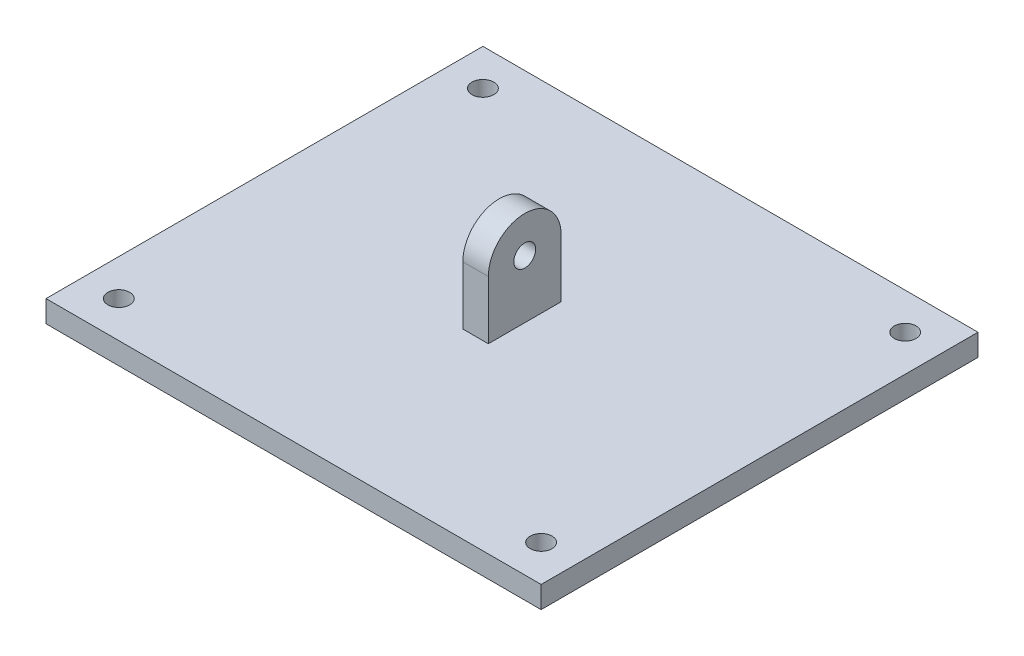
ISO-10303-21;
HEADER;
FILE_DESCRIPTION(('STEP AP214'),'2;1');
FILE_NAME('part.step','',(''),(''),'','','');
FILE_SCHEMA(('AUTOMOTIVE_DESIGN { 1 0 10303 214 1 1 1 1 }'));
ENDSEC;
DATA;
#1=APPLICATION_CONTEXT('core data for automotive mechanical design processes');
#2=APPLICATION_PROTOCOL_DEFINITION('international standard','automotive_design',2000,#1);
#3=PRODUCT_CONTEXT('',#1,'mechanical');
#4=PRODUCT('Part','Part','',(#3));
#5=PRODUCT_RELATED_PRODUCT_CATEGORY('part','',(#4));
#6=PRODUCT_DEFINITION_FORMATION('','',#4);
#7=PRODUCT_DEFINITION_CONTEXT('part definition',#1,'design');
#8=PRODUCT_DEFINITION('design','',#6,#7);
#9=PRODUCT_DEFINITION_SHAPE('','',#8);
#10=(LENGTH_UNIT() NAMED_UNIT(*) SI_UNIT(.MILLI.,.METRE.));
#11=(NAMED_UNIT(*) PLANE_ANGLE_UNIT() SI_UNIT($,.RADIAN.));
#12=(NAMED_UNIT(*) SI_UNIT($,.STERADIAN.) SOLID_ANGLE_UNIT());
#13=UNCERTAINTY_MEASURE_WITH_UNIT(LENGTH_MEASURE(1.E-05),#10,'distance_accuracy_value','');
#14=(GEOMETRIC_REPRESENTATION_CONTEXT(3) GLOBAL_UNCERTAINTY_ASSIGNED_CONTEXT((#13)) GLOBAL_UNIT_ASSIGNED_CONTEXT((#10,
#11,#12)) REPRESENTATION_CONTEXT('',''));
#15=CARTESIAN_POINT('',(0.,0.,0.));
#16=DIRECTION('',(0.,0.,1.));
#17=DIRECTION('',(1.,0.,0.));
#18=AXIS2_PLACEMENT_3D('',#15,#16,#17);
#19=CARTESIAN_POINT('',(-2.5,16.,5.));
#20=DIRECTION('',(0.,0.,-1.));
#21=DIRECTION('',(-1.,0.,0.));
#22=AXIS2_PLACEMENT_3D('',#19,#20,#21);
#23=PLANE('',#22);
#24=DIRECTION('',(1.,0.,0.));
#25=VECTOR('',#24,1.);
#26=CARTESIAN_POINT('',(-2.5,3.,5.));
#27=LINE('',#26,#25);
#28=CARTESIAN_POINT('',(-1.75,3.,5.));
#29=VERTEX_POINT('',#28);
#30=CARTESIAN_POINT('',(1.75,3.,5.));
#31=VERTEX_POINT('',#30);
#32=EDGE_CURVE('E109',#29,#31,#27,.T.);
#33=ORIENTED_EDGE('',*,*,#32,.T.);
#34=DIRECTION('',(0.,1.,0.));
#35=VECTOR('',#34,1.);
#36=CARTESIAN_POINT('',(1.75,3.,5.));
#37=LINE('',#36,#35);
#38=CARTESIAN_POINT('',(1.75,11.,5.));
#39=VERTEX_POINT('',#38);
#40=EDGE_CURVE('E113',#31,#39,#37,.T.);
#41=ORIENTED_EDGE('',*,*,#40,.T.);
#42=DIRECTION('',(1.,0.,0.));
#43=VECTOR('',#42,1.);
#44=CARTESIAN_POINT('',(-10.5,11.,5.));
#45=LINE('',#44,#43);
#46=CARTESIAN_POINT('',(-1.75000000000001,11.,5.));
#47=VERTEX_POINT('',#46);
#48=EDGE_CURVE('E128',#47,#39,#45,.T.);
#49=ORIENTED_EDGE('',*,*,#48,.F.);
#50=DIRECTION('',(0.,-1.,0.));
#51=VECTOR('',#50,1.);
#52=CARTESIAN_POINT('',(-1.75,3.,5.));
#53=LINE('',#52,#51);
#54=EDGE_CURVE('E61',#47,#29,#53,.T.);
#55=ORIENTED_EDGE('',*,*,#54,.T.);
#56=EDGE_LOOP('',(#33,#41,#49,#55));
#57=FACE_BOUND('',#56,.T.);
#58=ADVANCED_FACE('F36',(#57),#23,.F.);
#59=CARTESIAN_POINT('',(0.,3.,0.));
#60=DIRECTION('',(0.,1.,0.));
#61=DIRECTION('',(0.,0.,1.));
#62=AXIS2_PLACEMENT_3D('',#59,#60,#61);
#63=PLANE('',#62);
#64=DIRECTION('',(0.,0.,-1.));
#65=VECTOR('',#64,1.);
#66=CARTESIAN_POINT('',(1.75,3.,5.));
#67=LINE('',#66,#65);
#68=CARTESIAN_POINT('',(1.75,3.,-5.));
#69=VERTEX_POINT('',#68);
#70=EDGE_CURVE('E103',#31,#69,#67,.T.);
#71=ORIENTED_EDGE('',*,*,#70,.F.);
#72=ORIENTED_EDGE('',*,*,#32,.F.);
#73=DIRECTION('',(0.,0.,-1.));
#74=VECTOR('',#73,1.);
#75=CARTESIAN_POINT('',(-1.75,3.,5.));
#76=LINE('',#75,#74);
#77=CARTESIAN_POINT('',(-1.75,3.,-5.));
#78=VERTEX_POINT('',#77);
#79=EDGE_CURVE('E189',#29,#78,#76,.T.);
#80=ORIENTED_EDGE('',*,*,#79,.T.);
#81=DIRECTION('',(-1.,0.,0.));
#82=VECTOR('',#81,1.);
#83=CARTESIAN_POINT('',(-2.5,3.,-5.));
#84=LINE('',#83,#82);
#85=EDGE_CURVE('E111',#69,#78,#84,.T.);
#86=ORIENTED_EDGE('',*,*,#85,.F.);
#87=EDGE_LOOP('',(#71,#72,#80,#86));
#88=FACE_BOUND('',#87,.T.);
#89=CARTESIAN_POINT('',(-29.,3.,25.));
#90=DIRECTION('',(0.,1.,0.));
#91=DIRECTION('',(0.,0.,1.));
#92=AXIS2_PLACEMENT_3D('',#89,#90,#91);
#93=CIRCLE('',#92,1.5);
#94=CARTESIAN_POINT('',(-29.,3.,26.5));
#95=VERTEX_POINT('',#94);
#96=EDGE_CURVE('E135',#95,#95,#93,.T.);
#97=ORIENTED_EDGE('',*,*,#96,.F.);
#98=EDGE_LOOP('',(#97));
#99=FACE_BOUND('',#98,.T.);
#100=CARTESIAN_POINT('',(-29.,3.,-25.));
#101=DIRECTION('',(0.,1.,0.));
#102=DIRECTION('',(0.,0.,1.));
#103=AXIS2_PLACEMENT_3D('',#100,#101,#102);
#104=CIRCLE('',#103,1.5);
#105=CARTESIAN_POINT('',(-29.,3.,-23.5));
#106=VERTEX_POINT('',#105);
#107=EDGE_CURVE('E147',#106,#106,#104,.T.);
#108=ORIENTED_EDGE('',*,*,#107,.F.);
#109=EDGE_LOOP('',(#108));
#110=FACE_BOUND('',#109,.T.);
#111=DIRECTION('',(0.,0.,-1.));
#112=VECTOR('',#111,1.);
#113=CARTESIAN_POINT('',(34.,3.,-30.));
#114=LINE('',#113,#112);
#115=CARTESIAN_POINT('',(34.,3.,30.));
#116=VERTEX_POINT('',#115);
#117=CARTESIAN_POINT('',(34.,3.,-30.));
#118=VERTEX_POINT('',#117);
#119=EDGE_CURVE('E153',#116,#118,#114,.T.);
#120=ORIENTED_EDGE('',*,*,#119,.T.);
#121=DIRECTION('',(-1.,0.,0.));
#122=VECTOR('',#121,1.);
#123=CARTESIAN_POINT('',(-34.,3.,-30.));
#124=LINE('',#123,#122);
#125=CARTESIAN_POINT('',(-34.,3.,-30.));
#126=VERTEX_POINT('',#125);
#127=EDGE_CURVE('E156',#118,#126,#124,.T.);
#128=ORIENTED_EDGE('',*,*,#127,.T.);
#129=DIRECTION('',(0.,0.,1.));
#130=VECTOR('',#129,1.);
#131=CARTESIAN_POINT('',(-34.,3.,-30.));
#132=LINE('',#131,#130);
#133=CARTESIAN_POINT('',(-34.,3.,30.));
#134=VERTEX_POINT('',#133);
#135=EDGE_CURVE('E159',#126,#134,#132,.T.);
#136=ORIENTED_EDGE('',*,*,#135,.T.);
#137=DIRECTION('',(1.,0.,0.));
#138=VECTOR('',#137,1.);
#139=CARTESIAN_POINT('',(-34.,3.,30.));
#140=LINE('',#139,#138);
#141=EDGE_CURVE('E161',#134,#116,#140,.T.);
#142=ORIENTED_EDGE('',*,*,#141,.T.);
#143=EDGE_LOOP('',(#120,#128,#136,#142));
#144=FACE_BOUND('',#143,.T.);
#145=CARTESIAN_POINT('',(29.,3.,-25.0000000000001));
#146=DIRECTION('',(0.,1.,0.));
#147=DIRECTION('',(0.,0.,1.));
#148=AXIS2_PLACEMENT_3D('',#145,#146,#147);
#149=CIRCLE('',#148,1.5);
#150=CARTESIAN_POINT('',(29.,3.,-23.5000000000001));
#151=VERTEX_POINT('',#150);
#152=EDGE_CURVE('E141',#151,#151,#149,.T.);
#153=ORIENTED_EDGE('',*,*,#152,.F.);
#154=EDGE_LOOP('',(#153));
#155=FACE_BOUND('',#154,.T.);
#156=CARTESIAN_POINT('',(29.,3.,24.9999999999999));
#157=DIRECTION('',(0.,1.,0.));
#158=DIRECTION('',(0.,0.,1.));
#159=AXIS2_PLACEMENT_3D('',#156,#157,#158);
#160=CIRCLE('',#159,1.5);
#161=CARTESIAN_POINT('',(29.,3.,26.4999999999999));
#162=VERTEX_POINT('',#161);
#163=EDGE_CURVE('E126',#162,#162,#160,.T.);
#164=ORIENTED_EDGE('',*,*,#163,.F.);
#165=EDGE_LOOP('',(#164));
#166=FACE_BOUND('',#165,.T.);
#167=ADVANCED_FACE('F105',(#88,#99,#110,#144,#155,#166),#63,.T.);
#168=CARTESIAN_POINT('',(0.,0.,0.));
#169=DIRECTION('',(0.,1.,0.));
#170=DIRECTION('',(0.,0.,1.));
#171=AXIS2_PLACEMENT_3D('',#168,#169,#170);
#172=PLANE('',#171);
#173=DIRECTION('',(0.,0.,-1.));
#174=VECTOR('',#173,1.);
#175=CARTESIAN_POINT('',(34.,0.,-30.));
#176=LINE('',#175,#174);
#177=CARTESIAN_POINT('',(34.,0.,30.));
#178=VERTEX_POINT('',#177);
#179=CARTESIAN_POINT('',(34.,0.,-30.));
#180=VERTEX_POINT('',#179);
#181=EDGE_CURVE('E150',#178,#180,#176,.T.);
#182=ORIENTED_EDGE('',*,*,#181,.F.);
#183=DIRECTION('',(1.,0.,0.));
#184=VECTOR('',#183,1.);
#185=CARTESIAN_POINT('',(-34.,0.,30.));
#186=LINE('',#185,#184);
#187=CARTESIAN_POINT('',(-34.,0.,30.));
#188=VERTEX_POINT('',#187);
#189=EDGE_CURVE('E157',#188,#178,#186,.T.);
#190=ORIENTED_EDGE('',*,*,#189,.F.);
#191=DIRECTION('',(0.,0.,1.));
#192=VECTOR('',#191,1.);
#193=CARTESIAN_POINT('',(-34.,0.,-30.));
#194=LINE('',#193,#192);
#195=CARTESIAN_POINT('',(-34.,0.,-30.));
#196=VERTEX_POINT('',#195);
#197=EDGE_CURVE('E168',#196,#188,#194,.T.);
#198=ORIENTED_EDGE('',*,*,#197,.F.);
#199=DIRECTION('',(-1.,0.,0.));
#200=VECTOR('',#199,1.);
#201=CARTESIAN_POINT('',(-34.,0.,-30.));
#202=LINE('',#201,#200);
#203=EDGE_CURVE('E166',#180,#196,#202,.T.);
#204=ORIENTED_EDGE('',*,*,#203,.F.);
#205=EDGE_LOOP('',(#182,#190,#198,#204));
#206=FACE_BOUND('',#205,.T.);
#207=CARTESIAN_POINT('',(-29.,0.,-25.));
#208=DIRECTION('',(0.,1.,0.));
#209=DIRECTION('',(0.,0.,1.));
#210=AXIS2_PLACEMENT_3D('',#207,#208,#209);
#211=CIRCLE('',#210,1.5);
#212=CARTESIAN_POINT('',(-29.,0.,-23.5));
#213=VERTEX_POINT('',#212);
#214=EDGE_CURVE('E144',#213,#213,#211,.T.);
#215=ORIENTED_EDGE('',*,*,#214,.T.);
#216=EDGE_LOOP('',(#215));
#217=FACE_BOUND('',#216,.T.);
#218=CARTESIAN_POINT('',(29.,0.,-25.0000000000001));
#219=DIRECTION('',(0.,1.,0.));
#220=DIRECTION('',(0.,0.,1.));
#221=AXIS2_PLACEMENT_3D('',#218,#219,#220);
#222=CIRCLE('',#221,1.5);
#223=CARTESIAN_POINT('',(29.,0.,-23.5000000000001));
#224=VERTEX_POINT('',#223);
#225=EDGE_CURVE('E138',#224,#224,#222,.T.);
#226=ORIENTED_EDGE('',*,*,#225,.T.);
#227=EDGE_LOOP('',(#226));
#228=FACE_BOUND('',#227,.T.);
#229=CARTESIAN_POINT('',(-29.,0.,25.));
#230=DIRECTION('',(0.,1.,0.));
#231=DIRECTION('',(0.,0.,1.));
#232=AXIS2_PLACEMENT_3D('',#229,#230,#231);
#233=CIRCLE('',#232,1.5);
#234=CARTESIAN_POINT('',(-29.,0.,26.5));
#235=VERTEX_POINT('',#234);
#236=EDGE_CURVE('E133',#235,#235,#233,.T.);
#237=ORIENTED_EDGE('',*,*,#236,.T.);
#238=EDGE_LOOP('',(#237));
#239=FACE_BOUND('',#238,.T.);
#240=CARTESIAN_POINT('',(29.,0.,24.9999999999999));
#241=DIRECTION('',(0.,1.,0.));
#242=DIRECTION('',(0.,0.,1.));
#243=AXIS2_PLACEMENT_3D('',#240,#241,#242);
#244=CIRCLE('',#243,1.5);
#245=CARTESIAN_POINT('',(29.,0.,26.4999999999999));
#246=VERTEX_POINT('',#245);
#247=EDGE_CURVE('E123',#246,#246,#244,.T.);
#248=ORIENTED_EDGE('',*,*,#247,.T.);
#249=EDGE_LOOP('',(#248));
#250=FACE_BOUND('',#249,.T.);
#251=ADVANCED_FACE('F218',(#206,#217,#228,#239,#250),#172,.F.);
#252=CARTESIAN_POINT('',(34.,3.,-30.));
#253=DIRECTION('',(-1.,0.,0.));
#254=DIRECTION('',(0.,0.,1.));
#255=AXIS2_PLACEMENT_3D('',#252,#253,#254);
#256=PLANE('',#255);
#257=ORIENTED_EDGE('',*,*,#181,.T.);
#258=DIRECTION('',(0.,-1.,0.));
#259=VECTOR('',#258,1.);
#260=CARTESIAN_POINT('',(34.,3.,-30.));
#261=LINE('',#260,#259);
#262=EDGE_CURVE('E45',#118,#180,#261,.T.);
#263=ORIENTED_EDGE('',*,*,#262,.F.);
#264=ORIENTED_EDGE('',*,*,#119,.F.);
#265=DIRECTION('',(0.,-1.,0.));
#266=VECTOR('',#265,1.);
#267=CARTESIAN_POINT('',(34.,3.,30.));
#268=LINE('',#267,#266);
#269=EDGE_CURVE('E163',#116,#178,#268,.T.);
#270=ORIENTED_EDGE('',*,*,#269,.T.);
#271=EDGE_LOOP('',(#257,#263,#264,#270));
#272=FACE_BOUND('',#271,.T.);
#273=ADVANCED_FACE('F38',(#272),#256,.F.);
#274=CARTESIAN_POINT('',(-34.,3.,-30.));
#275=DIRECTION('',(0.,0.,1.));
#276=DIRECTION('',(1.,0.,0.));
#277=AXIS2_PLACEMENT_3D('',#274,#275,#276);
#278=PLANE('',#277);
#279=ORIENTED_EDGE('',*,*,#203,.T.);
#280=DIRECTION('',(0.,-1.,0.));
#281=VECTOR('',#280,1.);
#282=CARTESIAN_POINT('',(-34.,3.,-30.));
#283=LINE('',#282,#281);
#284=EDGE_CURVE('E176',#126,#196,#283,.T.);
#285=ORIENTED_EDGE('',*,*,#284,.F.);
#286=ORIENTED_EDGE('',*,*,#127,.F.);
#287=ORIENTED_EDGE('',*,*,#262,.T.);
#288=EDGE_LOOP('',(#279,#285,#286,#287));
#289=FACE_BOUND('',#288,.T.);
#290=ADVANCED_FACE('F248',(#289),#278,.F.);
#291=CARTESIAN_POINT('',(-34.,3.,-30.));
#292=DIRECTION('',(1.,0.,0.));
#293=DIRECTION('',(0.,0.,-1.));
#294=AXIS2_PLACEMENT_3D('',#291,#292,#293);
#295=PLANE('',#294);
#296=ORIENTED_EDGE('',*,*,#197,.T.);
#297=DIRECTION('',(0.,-1.,0.));
#298=VECTOR('',#297,1.);
#299=CARTESIAN_POINT('',(-34.,3.,30.));
#300=LINE('',#299,#298);
#301=EDGE_CURVE('E173',#134,#188,#300,.T.);
#302=ORIENTED_EDGE('',*,*,#301,.F.);
#303=ORIENTED_EDGE('',*,*,#135,.F.);
#304=ORIENTED_EDGE('',*,*,#284,.T.);
#305=EDGE_LOOP('',(#296,#302,#303,#304));
#306=FACE_BOUND('',#305,.T.);
#307=ADVANCED_FACE('F245',(#306),#295,.F.);
#308=CARTESIAN_POINT('',(-34.,3.,30.));
#309=DIRECTION('',(0.,0.,-1.));
#310=DIRECTION('',(-1.,0.,0.));
#311=AXIS2_PLACEMENT_3D('',#308,#309,#310);
#312=PLANE('',#311);
#313=ORIENTED_EDGE('',*,*,#189,.T.);
#314=ORIENTED_EDGE('',*,*,#269,.F.);
#315=ORIENTED_EDGE('',*,*,#141,.F.);
#316=ORIENTED_EDGE('',*,*,#301,.T.);
#317=EDGE_LOOP('',(#313,#314,#315,#316));
#318=FACE_BOUND('',#317,.T.);
#319=ADVANCED_FACE('F237',(#318),#312,.F.);
#320=CARTESIAN_POINT('',(-29.,3.,-25.));
#321=DIRECTION('',(0.,-1.,0.));
#322=DIRECTION('',(0.,0.,-1.));
#323=AXIS2_PLACEMENT_3D('',#320,#321,#322);
#324=CYLINDRICAL_SURFACE('',#323,1.5);
#325=ORIENTED_EDGE('',*,*,#107,.T.);
#326=EDGE_LOOP('',(#325));
#327=FACE_BOUND('',#326,.T.);
#328=ORIENTED_EDGE('',*,*,#214,.F.);
#329=EDGE_LOOP('',(#328));
#330=FACE_BOUND('',#329,.T.);
#331=ADVANCED_FACE('F234',(#327,#330),#324,.F.);
#332=CARTESIAN_POINT('',(29.,3.,-25.0000000000001));
#333=DIRECTION('',(0.,-1.,0.));
#334=DIRECTION('',(0.,0.,-1.));
#335=AXIS2_PLACEMENT_3D('',#332,#333,#334);
#336=CYLINDRICAL_SURFACE('',#335,1.5);
#337=ORIENTED_EDGE('',*,*,#152,.T.);
#338=EDGE_LOOP('',(#337));
#339=FACE_BOUND('',#338,.T.);
#340=ORIENTED_EDGE('',*,*,#225,.F.);
#341=EDGE_LOOP('',(#340));
#342=FACE_BOUND('',#341,.T.);
#343=ADVANCED_FACE('F230',(#339,#342),#336,.F.);
#344=CARTESIAN_POINT('',(-29.,3.,25.));
#345=DIRECTION('',(0.,-1.,0.));
#346=DIRECTION('',(0.,0.,-1.));
#347=AXIS2_PLACEMENT_3D('',#344,#345,#346);
#348=CYLINDRICAL_SURFACE('',#347,1.5);
#349=ORIENTED_EDGE('',*,*,#96,.T.);
#350=EDGE_LOOP('',(#349));
#351=FACE_BOUND('',#350,.T.);
#352=ORIENTED_EDGE('',*,*,#236,.F.);
#353=EDGE_LOOP('',(#352));
#354=FACE_BOUND('',#353,.T.);
#355=ADVANCED_FACE('F226',(#351,#354),#348,.F.);
#356=CARTESIAN_POINT('',(29.,3.,24.9999999999999));
#357=DIRECTION('',(0.,-1.,0.));
#358=DIRECTION('',(0.,0.,-1.));
#359=AXIS2_PLACEMENT_3D('',#356,#357,#358);
#360=CYLINDRICAL_SURFACE('',#359,1.5);
#361=ORIENTED_EDGE('',*,*,#163,.T.);
#362=EDGE_LOOP('',(#361));
#363=FACE_BOUND('',#362,.T.);
#364=ORIENTED_EDGE('',*,*,#247,.F.);
#365=EDGE_LOOP('',(#364));
#366=FACE_BOUND('',#365,.T.);
#367=ADVANCED_FACE('F223',(#363,#366),#360,.F.);
#368=CARTESIAN_POINT('',(-2.5,16.,-5.));
#369=DIRECTION('',(0.,0.,1.));
#370=DIRECTION('',(1.,0.,0.));
#371=AXIS2_PLACEMENT_3D('',#368,#369,#370);
#372=PLANE('',#371);
#373=DIRECTION('',(1.,0.,0.));
#374=VECTOR('',#373,1.);
#375=CARTESIAN_POINT('',(-10.5,11.,-5.));
#376=LINE('',#375,#374);
#377=CARTESIAN_POINT('',(-1.75,11.,-5.));
#378=VERTEX_POINT('',#377);
#379=CARTESIAN_POINT('',(1.74999999999999,11.,-5.));
#380=VERTEX_POINT('',#379);
#381=EDGE_CURVE('E11',#378,#380,#376,.T.);
#382=ORIENTED_EDGE('',*,*,#381,.T.);
#383=DIRECTION('',(0.,1.,0.));
#384=VECTOR('',#383,1.);
#385=CARTESIAN_POINT('',(1.75,3.,-5.));
#386=LINE('',#385,#384);
#387=EDGE_CURVE('E53',#69,#380,#386,.T.);
#388=ORIENTED_EDGE('',*,*,#387,.F.);
#389=ORIENTED_EDGE('',*,*,#85,.T.);
#390=DIRECTION('',(0.,-1.,0.));
#391=VECTOR('',#390,1.);
#392=CARTESIAN_POINT('',(-1.75,3.,-5.));
#393=LINE('',#392,#391);
#394=EDGE_CURVE('E196',#378,#78,#393,.T.);
#395=ORIENTED_EDGE('',*,*,#394,.F.);
#396=EDGE_LOOP('',(#382,#388,#389,#395));
#397=FACE_BOUND('',#396,.T.);
#398=ADVANCED_FACE('F195',(#397),#372,.F.);
#399=CARTESIAN_POINT('',(-10.5,11.,0.));
#400=DIRECTION('',(1.,0.,0.));
#401=DIRECTION('',(0.,0.,-1.));
#402=AXIS2_PLACEMENT_3D('',#399,#400,#401);
#403=CYLINDRICAL_SURFACE('',#402,5.);
#404=CARTESIAN_POINT('',(1.75,11.,0.));
#405=DIRECTION('',(-1.,0.,0.));
#406=DIRECTION('',(0.,0.,1.));
#407=AXIS2_PLACEMENT_3D('',#404,#405,#406);
#408=CIRCLE('',#407,5.);
#409=EDGE_CURVE('E118',#380,#39,#408,.F.);
#410=ORIENTED_EDGE('',*,*,#409,.F.);
#411=ORIENTED_EDGE('',*,*,#381,.F.);
#412=CARTESIAN_POINT('',(-1.75,11.,0.));
#413=DIRECTION('',(1.,0.,0.));
#414=DIRECTION('',(0.,0.,-1.));
#415=AXIS2_PLACEMENT_3D('',#412,#413,#414);
#416=CIRCLE('',#415,5.);
#417=EDGE_CURVE('E181',#47,#378,#416,.F.);
#418=ORIENTED_EDGE('',*,*,#417,.F.);
#419=ORIENTED_EDGE('',*,*,#48,.T.);
#420=EDGE_LOOP('',(#410,#411,#418,#419));
#421=FACE_BOUND('',#420,.T.);
#422=ADVANCED_FACE('F192',(#421),#403,.T.);
#423=CARTESIAN_POINT('',(-1.75,3.,5.));
#424=DIRECTION('',(1.,0.,0.));
#425=DIRECTION('',(0.,0.,-1.));
#426=AXIS2_PLACEMENT_3D('',#423,#424,#425);
#427=PLANE('',#426);
#428=ORIENTED_EDGE('',*,*,#417,.T.);
#429=ORIENTED_EDGE('',*,*,#394,.T.);
#430=ORIENTED_EDGE('',*,*,#79,.F.);
#431=ORIENTED_EDGE('',*,*,#54,.F.);
#432=EDGE_LOOP('',(#428,#429,#430,#431));
#433=FACE_BOUND('',#432,.T.);
#434=CARTESIAN_POINT('',(-1.75,11.,0.));
#435=DIRECTION('',(1.,0.,0.));
#436=DIRECTION('',(0.,0.,-1.));
#437=AXIS2_PLACEMENT_3D('',#434,#435,#436);
#438=CIRCLE('',#437,1.5);
#439=CARTESIAN_POINT('',(-1.75,11.,-1.5));
#440=VERTEX_POINT('',#439);
#441=EDGE_CURVE('E112',#440,#440,#438,.F.);
#442=ORIENTED_EDGE('',*,*,#441,.F.);
#443=EDGE_LOOP('',(#442));
#444=FACE_BOUND('',#443,.T.);
#445=ADVANCED_FACE('F199',(#433,#444),#427,.F.);
#446=CARTESIAN_POINT('',(1.75,3.,5.));
#447=DIRECTION('',(-1.,0.,0.));
#448=DIRECTION('',(0.,0.,1.));
#449=AXIS2_PLACEMENT_3D('',#446,#447,#448);
#450=PLANE('',#449);
#451=ORIENTED_EDGE('',*,*,#409,.T.);
#452=ORIENTED_EDGE('',*,*,#40,.F.);
#453=ORIENTED_EDGE('',*,*,#70,.T.);
#454=ORIENTED_EDGE('',*,*,#387,.T.);
#455=EDGE_LOOP('',(#451,#452,#453,#454));
#456=FACE_BOUND('',#455,.T.);
#457=CARTESIAN_POINT('',(1.75,11.,0.));
#458=DIRECTION('',(-1.,0.,0.));
#459=DIRECTION('',(0.,0.,1.));
#460=AXIS2_PLACEMENT_3D('',#457,#458,#459);
#461=CIRCLE('',#460,1.5);
#462=CARTESIAN_POINT('',(1.75,11.,-1.5));
#463=VERTEX_POINT('',#462);
#464=EDGE_CURVE('E40',#463,#463,#461,.F.);
#465=ORIENTED_EDGE('',*,*,#464,.F.);
#466=EDGE_LOOP('',(#465));
#467=FACE_BOUND('',#466,.T.);
#468=ADVANCED_FACE('F116',(#456,#467),#450,.F.);
#469=CARTESIAN_POINT('',(-10.5,11.,0.));
#470=DIRECTION('',(1.,0.,0.));
#471=DIRECTION('',(0.,0.,-1.));
#472=AXIS2_PLACEMENT_3D('',#469,#470,#471);
#473=CYLINDRICAL_SURFACE('',#472,1.5);
#474=CARTESIAN_POINT('',(1.75,11.,-1.5));
#475=CARTESIAN_POINT('',(1.71354166666667,11.,-1.5));
#476=CARTESIAN_POINT('',(1.67708333333333,11.,-1.5));
#477=CARTESIAN_POINT('',(1.60416666666667,11.,-1.5));
#478=CARTESIAN_POINT('',(1.56770833333333,11.,-1.5));
#479=CARTESIAN_POINT('',(1.49479166666667,11.,-1.5));
#480=CARTESIAN_POINT('',(1.45833333333333,11.,-1.5));
#481=CARTESIAN_POINT('',(1.38541666666667,11.,-1.5));
#482=CARTESIAN_POINT('',(1.34895833333333,11.,-1.5));
#483=CARTESIAN_POINT('',(1.27604166666667,11.,-1.5));
#484=CARTESIAN_POINT('',(1.23958333333333,11.,-1.5));
#485=CARTESIAN_POINT('',(1.16666666666667,11.,-1.5));
#486=CARTESIAN_POINT('',(1.13020833333333,11.,-1.5));
#487=CARTESIAN_POINT('',(1.05729166666667,11.,-1.5));
#488=CARTESIAN_POINT('',(1.02083333333333,11.,-1.5));
#489=CARTESIAN_POINT('',(0.947916666666666,11.,-1.5));
#490=CARTESIAN_POINT('',(0.911458333333332,11.,-1.5));
#491=CARTESIAN_POINT('',(0.838541666666666,11.,-1.5));
#492=CARTESIAN_POINT('',(0.802083333333333,11.,-1.5));
#493=CARTESIAN_POINT('',(0.729166666666667,11.,-1.5));
#494=CARTESIAN_POINT('',(0.692708333333334,11.,-1.5));
#495=CARTESIAN_POINT('',(0.619791666666667,11.,-1.5));
#496=CARTESIAN_POINT('',(0.583333333333334,11.,-1.5));
#497=CARTESIAN_POINT('',(0.510416666666667,11.,-1.5));
#498=CARTESIAN_POINT('',(0.473958333333334,11.,-1.5));
#499=CARTESIAN_POINT('',(0.401041666666667,11.,-1.5));
#500=CARTESIAN_POINT('',(0.364583333333334,11.,-1.5));
#501=CARTESIAN_POINT('',(0.291666666666667,11.,-1.5));
#502=CARTESIAN_POINT('',(0.255208333333334,11.,-1.5));
#503=CARTESIAN_POINT('',(0.182291666666667,11.,-1.5));
#504=CARTESIAN_POINT('',(0.145833333333333,11.,-1.5));
#505=CARTESIAN_POINT('',(0.0729166666666667,11.,-1.5));
#506=CARTESIAN_POINT('',(0.0364583333333334,11.,-1.5));
#507=CARTESIAN_POINT('',(-0.0364583333333334,11.,-1.5));
#508=CARTESIAN_POINT('',(-0.0729166666666667,11.,-1.5));
#509=CARTESIAN_POINT('',(-0.145833333333333,11.,-1.5));
#510=CARTESIAN_POINT('',(-0.182291666666667,11.,-1.5));
#511=CARTESIAN_POINT('',(-0.255208333333334,11.,-1.5));
#512=CARTESIAN_POINT('',(-0.291666666666667,11.,-1.5));
#513=CARTESIAN_POINT('',(-0.364583333333334,11.,-1.5));
#514=CARTESIAN_POINT('',(-0.401041666666667,11.,-1.5));
#515=CARTESIAN_POINT('',(-0.473958333333334,11.,-1.5));
#516=CARTESIAN_POINT('',(-0.510416666666667,11.,-1.5));
#517=CARTESIAN_POINT('',(-0.583333333333333,11.,-1.5));
#518=CARTESIAN_POINT('',(-0.619791666666666,11.,-1.5));
#519=CARTESIAN_POINT('',(-0.692708333333333,11.,-1.5));
#520=CARTESIAN_POINT('',(-0.729166666666667,11.,-1.5));
#521=CARTESIAN_POINT('',(-0.802083333333333,11.,-1.5));
#522=CARTESIAN_POINT('',(-0.838541666666666,11.,-1.5));
#523=CARTESIAN_POINT('',(-0.911458333333333,11.,-1.5));
#524=CARTESIAN_POINT('',(-0.947916666666667,11.,-1.5));
#525=CARTESIAN_POINT('',(-1.02083333333333,11.,-1.5));
#526=CARTESIAN_POINT('',(-1.05729166666667,11.,-1.5));
#527=CARTESIAN_POINT('',(-1.13020833333333,11.,-1.5));
#528=CARTESIAN_POINT('',(-1.16666666666667,11.,-1.5));
#529=CARTESIAN_POINT('',(-1.23958333333333,11.,-1.5));
#530=CARTESIAN_POINT('',(-1.27604166666667,11.,-1.5));
#531=CARTESIAN_POINT('',(-1.34895833333333,11.,-1.5));
#532=CARTESIAN_POINT('',(-1.38541666666667,11.,-1.5));
#533=CARTESIAN_POINT('',(-1.45833333333333,11.,-1.5));
#534=CARTESIAN_POINT('',(-1.49479166666667,11.,-1.5));
#535=CARTESIAN_POINT('',(-1.56770833333333,11.,-1.5));
#536=CARTESIAN_POINT('',(-1.60416666666667,11.,-1.5));
#537=CARTESIAN_POINT('',(-1.67708333333333,11.,-1.5));
#538=CARTESIAN_POINT('',(-1.71354166666667,11.,-1.5));
#539=CARTESIAN_POINT('',(-1.75,11.,-1.5));
#540=B_SPLINE_CURVE_WITH_KNOTS('',3,(#474,#475,#476,#477,#478,#479,#480,#481,#482,#483,#484,
#485,#486,#487,#488,#489,#490,#491,#492,#493,#494,#495,#496,#497,#498,#499,#500,#501,#502,#503,
#504,#505,#506,#507,#508,#509,#510,#511,#512,#513,#514,#515,#516,#517,#518,#519,#520,#521,#522,
#523,#524,#525,#526,#527,#528,#529,#530,#531,#532,#533,#534,#535,#536,#537,#538,#539),
.UNSPECIFIED.,.F.,.F.,(4,2,2,2,2,2,2,2,2,2,2,2,2,2,2,2,2,2,2,2,2,2,2,2,2,2,2,2,2,2,2,2,4),(0.,
0.109375,0.21875,0.328125,0.4375,0.546875,0.656250000000001,0.765625000000001,0.875000000000001,
0.984374999999999,1.09375,1.203125,1.3125,1.421875,1.53125,1.640625,1.75,1.859375,1.96875,
2.078125,2.1875,2.296875,2.40625,2.515625,2.625,2.734375,2.84375,2.953125,3.0625,3.171875,
3.28125,3.390625,3.5),.UNSPECIFIED.);
#541=EDGE_CURVE('BSEAM207',#463,#440,#540,.T.);
#542=ORIENTED_EDGE('',*,*,#464,.T.);
#543=ORIENTED_EDGE('',*,*,#441,.T.);
#544=ORIENTED_EDGE('',*,*,#541,.T.);
#545=ORIENTED_EDGE('',*,*,#541,.F.);
#546=EDGE_LOOP('',(#542,#544,#543,#545));
#547=FACE_BOUND('',#546,.T.);
#548=ADVANCED_FACE('F207',(#547),#473,.F.);
#549=CLOSED_SHELL('',(#58,#167,#251,#273,#290,#307,#319,#331,#343,#355,#367,#398,#422,#445,#468,#548));
#550=MANIFOLD_SOLID_BREP('B2',#549);
#551=ADVANCED_BREP_SHAPE_REPRESENTATION('',(#18,#550),#14);
#552=SHAPE_DEFINITION_REPRESENTATION(#9,#551);
ENDSEC;
END-ISO-10303-21;
